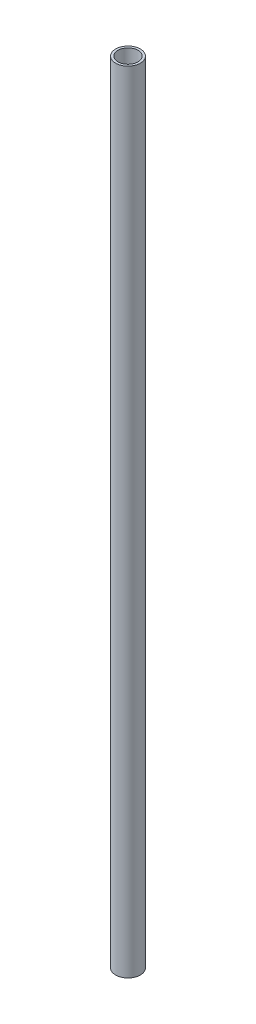
ISO-10303-21;
HEADER;
FILE_DESCRIPTION(('STEP AP214'),'2;1');
FILE_NAME('part.step','',(''),(''),'','','');
FILE_SCHEMA(('AUTOMOTIVE_DESIGN { 1 0 10303 214 1 1 1 1 }'));
ENDSEC;
DATA;
#1=APPLICATION_CONTEXT('core data for automotive mechanical design processes');
#2=APPLICATION_PROTOCOL_DEFINITION('international standard','automotive_design',2000,#1);
#3=PRODUCT_CONTEXT('',#1,'mechanical');
#4=PRODUCT('Part','Part','',(#3));
#5=PRODUCT_RELATED_PRODUCT_CATEGORY('part','',(#4));
#6=PRODUCT_DEFINITION_FORMATION('','',#4);
#7=PRODUCT_DEFINITION_CONTEXT('part definition',#1,'design');
#8=PRODUCT_DEFINITION('design','',#6,#7);
#9=PRODUCT_DEFINITION_SHAPE('','',#8);
#10=(LENGTH_UNIT() NAMED_UNIT(*) SI_UNIT(.MILLI.,.METRE.));
#11=(NAMED_UNIT(*) PLANE_ANGLE_UNIT() SI_UNIT($,.RADIAN.));
#12=(NAMED_UNIT(*) SI_UNIT($,.STERADIAN.) SOLID_ANGLE_UNIT());
#13=UNCERTAINTY_MEASURE_WITH_UNIT(LENGTH_MEASURE(1.E-05),#10,'distance_accuracy_value','');
#14=(GEOMETRIC_REPRESENTATION_CONTEXT(3) GLOBAL_UNCERTAINTY_ASSIGNED_CONTEXT((#13)) GLOBAL_UNIT_ASSIGNED_CONTEXT((#10,
#11,#12)) REPRESENTATION_CONTEXT('',''));
#15=CARTESIAN_POINT('',(0.,0.,0.));
#16=DIRECTION('',(0.,0.,1.));
#17=DIRECTION('',(1.,0.,0.));
#18=AXIS2_PLACEMENT_3D('',#15,#16,#17);
#19=CARTESIAN_POINT('',(0.,508.,0.));
#20=DIRECTION('',(0.,1.,0.));
#21=DIRECTION('',(0.,0.,1.));
#22=AXIS2_PLACEMENT_3D('',#19,#20,#21);
#23=PLANE('',#22);
#24=CARTESIAN_POINT('',(0.,508.,0.));
#25=DIRECTION('',(0.,1.,0.));
#26=DIRECTION('',(0.,0.,1.));
#27=AXIS2_PLACEMENT_3D('',#24,#25,#26);
#28=CIRCLE('',#27,7.9375);
#29=CARTESIAN_POINT('',(0.,508.,7.9375));
#30=VERTEX_POINT('',#29);
#31=EDGE_CURVE('E10',#30,#30,#28,.T.);
#32=ORIENTED_EDGE('',*,*,#31,.T.);
#33=EDGE_LOOP('',(#32));
#34=FACE_BOUND('',#33,.T.);
#35=CARTESIAN_POINT('',(0.,508.,0.));
#36=DIRECTION('',(0.,1.,0.));
#37=DIRECTION('',(0.,0.,1.));
#38=AXIS2_PLACEMENT_3D('',#35,#36,#37);
#39=CIRCLE('',#38,6.4643);
#40=CARTESIAN_POINT('',(0.,508.,6.4643));
#41=VERTEX_POINT('',#40);
#42=EDGE_CURVE('E48',#41,#41,#39,.T.);
#43=ORIENTED_EDGE('',*,*,#42,.F.);
#44=EDGE_LOOP('',(#43));
#45=FACE_BOUND('',#44,.T.);
#46=ADVANCED_FACE('F37',(#34,#45),#23,.T.);
#47=CARTESIAN_POINT('',(0.,0.,0.));
#48=DIRECTION('',(0.,1.,0.));
#49=DIRECTION('',(0.,0.,1.));
#50=AXIS2_PLACEMENT_3D('',#47,#48,#49);
#51=PLANE('',#50);
#52=CARTESIAN_POINT('',(0.,0.,0.));
#53=DIRECTION('',(0.,1.,0.));
#54=DIRECTION('',(0.,0.,1.));
#55=AXIS2_PLACEMENT_3D('',#52,#53,#54);
#56=CIRCLE('',#55,7.9375);
#57=CARTESIAN_POINT('',(0.,0.,7.9375));
#58=VERTEX_POINT('',#57);
#59=EDGE_CURVE('E41',#58,#58,#56,.T.);
#60=ORIENTED_EDGE('',*,*,#59,.F.);
#61=EDGE_LOOP('',(#60));
#62=FACE_BOUND('',#61,.T.);
#63=CARTESIAN_POINT('',(0.,0.,0.));
#64=DIRECTION('',(0.,1.,0.));
#65=DIRECTION('',(0.,0.,1.));
#66=AXIS2_PLACEMENT_3D('',#63,#64,#65);
#67=CIRCLE('',#66,6.4643);
#68=CARTESIAN_POINT('',(0.,0.,6.4643));
#69=VERTEX_POINT('',#68);
#70=EDGE_CURVE('E50',#69,#69,#67,.T.);
#71=ORIENTED_EDGE('',*,*,#70,.T.);
#72=EDGE_LOOP('',(#71));
#73=FACE_BOUND('',#72,.T.);
#74=ADVANCED_FACE('F60',(#62,#73),#51,.F.);
#75=CARTESIAN_POINT('',(0.,508.,0.));
#76=DIRECTION('',(0.,-1.,0.));
#77=DIRECTION('',(0.,0.,-1.));
#78=AXIS2_PLACEMENT_3D('',#75,#76,#77);
#79=CYLINDRICAL_SURFACE('',#78,7.9375);
#80=ORIENTED_EDGE('',*,*,#31,.F.);
#81=EDGE_LOOP('',(#80));
#82=FACE_BOUND('',#81,.T.);
#83=ORIENTED_EDGE('',*,*,#59,.T.);
#84=EDGE_LOOP('',(#83));
#85=FACE_BOUND('',#84,.T.);
#86=ADVANCED_FACE('F39',(#82,#85),#79,.T.);
#87=CARTESIAN_POINT('',(0.,508.,0.));
#88=DIRECTION('',(0.,-1.,0.));
#89=DIRECTION('',(0.,0.,-1.));
#90=AXIS2_PLACEMENT_3D('',#87,#88,#89);
#91=CYLINDRICAL_SURFACE('',#90,6.4643);
#92=ORIENTED_EDGE('',*,*,#42,.T.);
#93=EDGE_LOOP('',(#92));
#94=FACE_BOUND('',#93,.T.);
#95=ORIENTED_EDGE('',*,*,#70,.F.);
#96=EDGE_LOOP('',(#95));
#97=FACE_BOUND('',#96,.T.);
#98=ADVANCED_FACE('F56',(#94,#97),#91,.F.);
#99=CLOSED_SHELL('',(#46,#74,#86,#98));
#100=MANIFOLD_SOLID_BREP('B2',#99);
#101=ADVANCED_BREP_SHAPE_REPRESENTATION('',(#18,#100),#14);
#102=SHAPE_DEFINITION_REPRESENTATION(#9,#101);
ENDSEC;
END-ISO-10303-21;
